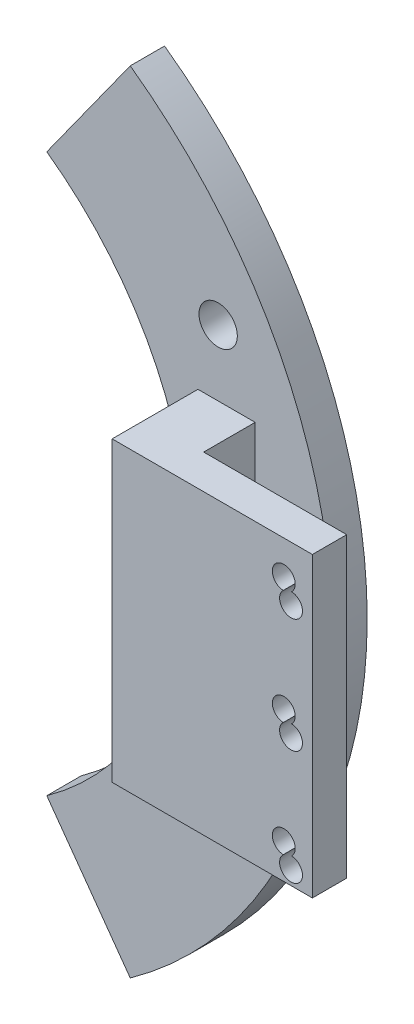
ISO-10303-21;
HEADER;
FILE_DESCRIPTION(('STEP AP214'),'2;1');
FILE_NAME('part.step','',(''),(''),'','','');
FILE_SCHEMA(('AUTOMOTIVE_DESIGN { 1 0 10303 214 1 1 1 1 }'));
ENDSEC;
DATA;
#1=APPLICATION_CONTEXT('core data for automotive mechanical design processes');
#2=APPLICATION_PROTOCOL_DEFINITION('international standard','automotive_design',2000,#1);
#3=PRODUCT_CONTEXT('',#1,'mechanical');
#4=PRODUCT('Part','Part','',(#3));
#5=PRODUCT_RELATED_PRODUCT_CATEGORY('part','',(#4));
#6=PRODUCT_DEFINITION_FORMATION('','',#4);
#7=PRODUCT_DEFINITION_CONTEXT('part definition',#1,'design');
#8=PRODUCT_DEFINITION('design','',#6,#7);
#9=PRODUCT_DEFINITION_SHAPE('','',#8);
#10=(LENGTH_UNIT() NAMED_UNIT(*) SI_UNIT(.MILLI.,.METRE.));
#11=(NAMED_UNIT(*) PLANE_ANGLE_UNIT() SI_UNIT($,.RADIAN.));
#12=(NAMED_UNIT(*) SI_UNIT($,.STERADIAN.) SOLID_ANGLE_UNIT());
#13=UNCERTAINTY_MEASURE_WITH_UNIT(LENGTH_MEASURE(1.E-05),#10,'distance_accuracy_value','');
#14=(GEOMETRIC_REPRESENTATION_CONTEXT(3) GLOBAL_UNCERTAINTY_ASSIGNED_CONTEXT((#13)) GLOBAL_UNIT_ASSIGNED_CONTEXT((#10,
#11,#12)) REPRESENTATION_CONTEXT('',''));
#15=CARTESIAN_POINT('',(0.,0.,0.));
#16=DIRECTION('',(0.,0.,1.));
#17=DIRECTION('',(1.,0.,0.));
#18=AXIS2_PLACEMENT_3D('',#15,#16,#17);
#19=CARTESIAN_POINT('',(71.4195328291549,25.9902704667621,21.));
#20=DIRECTION('',(-1.,0.,0.));
#21=DIRECTION('',(0.,0.,1.));
#22=AXIS2_PLACEMENT_3D('',#19,#20,#21);
#23=PLANE('',#22);
#24=DIRECTION('',(0.,1.,0.));
#25=VECTOR('',#24,1.);
#26=CARTESIAN_POINT('',(71.4195328291549,25.9902704667621,15.));
#27=LINE('',#26,#25);
#28=CARTESIAN_POINT('',(71.4195328291549,-26.0097295332379,15.));
#29=VERTEX_POINT('',#28);
#30=CARTESIAN_POINT('',(71.4195328291549,25.9902704667621,15.));
#31=VERTEX_POINT('',#30);
#32=EDGE_CURVE('E190',#29,#31,#27,.T.);
#33=ORIENTED_EDGE('',*,*,#32,.F.);
#34=DIRECTION('',(0.,0.,-1.));
#35=VECTOR('',#34,1.);
#36=CARTESIAN_POINT('',(71.4195328291549,-26.0097295332379,21.));
#37=LINE('',#36,#35);
#38=CARTESIAN_POINT('',(71.4195328291549,-26.0097295332379,6.));
#39=VERTEX_POINT('',#38);
#40=EDGE_CURVE('E211',#29,#39,#37,.T.);
#41=ORIENTED_EDGE('',*,*,#40,.T.);
#42=DIRECTION('',(0.,1.,0.));
#43=VECTOR('',#42,1.);
#44=CARTESIAN_POINT('',(71.4195328291549,25.9902704667621,6.));
#45=LINE('',#44,#43);
#46=CARTESIAN_POINT('',(71.4195328291549,25.9902704667621,6.));
#47=VERTEX_POINT('',#46);
#48=EDGE_CURVE('E223',#39,#47,#45,.T.);
#49=ORIENTED_EDGE('',*,*,#48,.T.);
#50=DIRECTION('',(0.,0.,-1.));
#51=VECTOR('',#50,1.);
#52=CARTESIAN_POINT('',(71.4195328291549,25.9902704667621,21.));
#53=LINE('',#52,#51);
#54=EDGE_CURVE('E204',#31,#47,#53,.T.);
#55=ORIENTED_EDGE('',*,*,#54,.F.);
#56=EDGE_LOOP('',(#33,#41,#49,#55));
#57=FACE_BOUND('',#56,.T.);
#58=ADVANCED_FACE('F41',(#57),#23,.F.);
#59=CARTESIAN_POINT('',(0.,0.,6.));
#60=DIRECTION('',(0.,0.,1.));
#61=DIRECTION('',(1.,0.,0.));
#62=AXIS2_PLACEMENT_3D('',#59,#60,#61);
#63=PLANE('',#62);
#64=DIRECTION('',(0.583333333333333,0.812232862067414,0.));
#65=VECTOR('',#64,1.);
#66=CARTESIAN_POINT('',(0.,0.,6.));
#67=LINE('',#66,#65);
#68=CARTESIAN_POINT('',(35.,48.7339717240448,6.));
#69=VERTEX_POINT('',#68);
#70=CARTESIAN_POINT('',(49.5833333333334,69.0397932757302,6.));
#71=VERTEX_POINT('',#70);
#72=EDGE_CURVE('E175',#69,#71,#67,.T.);
#73=ORIENTED_EDGE('',*,*,#72,.F.);
#74=CARTESIAN_POINT('',(0.,0.,6.));
#75=DIRECTION('',(0.,0.,1.));
#76=DIRECTION('',(1.,0.,0.));
#77=AXIS2_PLACEMENT_3D('',#74,#75,#76);
#78=CIRCLE('',#77,60.);
#79=CARTESIAN_POINT('',(35.,-48.7339717240448,6.));
#80=VERTEX_POINT('',#79);
#81=EDGE_CURVE('E237',#80,#69,#78,.T.);
#82=ORIENTED_EDGE('',*,*,#81,.F.);
#83=DIRECTION('',(-0.583333333333333,0.812232862067414,0.));
#84=VECTOR('',#83,1.);
#85=CARTESIAN_POINT('',(0.,0.,6.));
#86=LINE('',#85,#84);
#87=CARTESIAN_POINT('',(49.5833333333333,-69.0397932757302,6.));
#88=VERTEX_POINT('',#87);
#89=EDGE_CURVE('E292',#88,#80,#86,.T.);
#90=ORIENTED_EDGE('',*,*,#89,.F.);
#91=CARTESIAN_POINT('',(0.,0.,6.));
#92=DIRECTION('',(0.,0.,1.));
#93=DIRECTION('',(1.,0.,0.));
#94=AXIS2_PLACEMENT_3D('',#91,#92,#93);
#95=CIRCLE('',#94,85.);
#96=EDGE_CURVE('E245',#88,#71,#95,.T.);
#97=ORIENTED_EDGE('',*,*,#96,.T.);
#98=EDGE_LOOP('',(#73,#82,#90,#97));
#99=FACE_BOUND('',#98,.T.);
#100=CARTESIAN_POINT('',(64.9519052838327,-37.5000000000003,6.));
#101=DIRECTION('',(0.,0.,1.));
#102=DIRECTION('',(1.,0.,0.));
#103=AXIS2_PLACEMENT_3D('',#100,#101,#102);
#104=CIRCLE('',#103,3.35);
#105=CARTESIAN_POINT('',(68.3019052838327,-37.5000000000003,6.));
#106=VERTEX_POINT('',#105);
#107=EDGE_CURVE('E226',#106,#106,#104,.T.);
#108=ORIENTED_EDGE('',*,*,#107,.F.);
#109=EDGE_LOOP('',(#108));
#110=FACE_BOUND('',#109,.T.);
#111=CARTESIAN_POINT('',(64.951905283833,37.4999999999998,6.));
#112=DIRECTION('',(0.,0.,1.));
#113=DIRECTION('',(1.,0.,0.));
#114=AXIS2_PLACEMENT_3D('',#111,#112,#113);
#115=CIRCLE('',#114,3.35);
#116=CARTESIAN_POINT('',(68.301905283833,37.4999999999998,6.));
#117=VERTEX_POINT('',#116);
#118=EDGE_CURVE('E231',#117,#117,#115,.T.);
#119=ORIENTED_EDGE('',*,*,#118,.F.);
#120=EDGE_LOOP('',(#119));
#121=FACE_BOUND('',#120,.T.);
#122=DIRECTION('',(-1.,0.,0.));
#123=VECTOR('',#122,1.);
#124=CARTESIAN_POINT('',(71.4195328291549,25.9902704667621,6.));
#125=LINE('',#124,#123);
#126=CARTESIAN_POINT('',(61.4195328291549,25.9902704667621,6.));
#127=VERTEX_POINT('',#126);
#128=EDGE_CURVE('E221',#47,#127,#125,.T.);
#129=ORIENTED_EDGE('',*,*,#128,.F.);
#130=ORIENTED_EDGE('',*,*,#48,.F.);
#131=DIRECTION('',(1.,0.,0.));
#132=VECTOR('',#131,1.);
#133=CARTESIAN_POINT('',(71.4195328291549,-26.0097295332379,6.));
#134=LINE('',#133,#132);
#135=CARTESIAN_POINT('',(61.4195328291549,-26.0097295332379,6.));
#136=VERTEX_POINT('',#135);
#137=EDGE_CURVE('E214',#136,#39,#134,.T.);
#138=ORIENTED_EDGE('',*,*,#137,.F.);
#139=DIRECTION('',(0.,-1.,0.));
#140=VECTOR('',#139,1.);
#141=CARTESIAN_POINT('',(61.4195328291549,25.9902704667621,6.));
#142=LINE('',#141,#140);
#143=EDGE_CURVE('E217',#127,#136,#142,.T.);
#144=ORIENTED_EDGE('',*,*,#143,.F.);
#145=EDGE_LOOP('',(#129,#130,#138,#144));
#146=FACE_BOUND('',#145,.T.);
#147=ADVANCED_FACE('F311',(#99,#110,#121,#146),#63,.T.);
#148=CARTESIAN_POINT('',(0.,0.,0.));
#149=DIRECTION('',(0.,0.,1.));
#150=DIRECTION('',(1.,0.,0.));
#151=AXIS2_PLACEMENT_3D('',#148,#149,#150);
#152=PLANE('',#151);
#153=CARTESIAN_POINT('',(64.9519052838327,-37.5000000000003,0.));
#154=DIRECTION('',(0.,0.,1.));
#155=DIRECTION('',(1.,0.,0.));
#156=AXIS2_PLACEMENT_3D('',#153,#154,#155);
#157=CIRCLE('',#156,3.35);
#158=CARTESIAN_POINT('',(68.3019052838327,-37.5000000000003,0.));
#159=VERTEX_POINT('',#158);
#160=EDGE_CURVE('E244',#159,#159,#157,.T.);
#161=ORIENTED_EDGE('',*,*,#160,.T.);
#162=EDGE_LOOP('',(#161));
#163=FACE_BOUND('',#162,.T.);
#164=CARTESIAN_POINT('',(64.951905283833,37.4999999999998,0.));
#165=DIRECTION('',(0.,0.,1.));
#166=DIRECTION('',(1.,0.,0.));
#167=AXIS2_PLACEMENT_3D('',#164,#165,#166);
#168=CIRCLE('',#167,3.35);
#169=CARTESIAN_POINT('',(68.301905283833,37.4999999999998,0.));
#170=VERTEX_POINT('',#169);
#171=EDGE_CURVE('E234',#170,#170,#168,.T.);
#172=ORIENTED_EDGE('',*,*,#171,.T.);
#173=EDGE_LOOP('',(#172));
#174=FACE_BOUND('',#173,.T.);
#175=CARTESIAN_POINT('',(0.,0.,0.));
#176=DIRECTION('',(0.,0.,1.));
#177=DIRECTION('',(1.,0.,0.));
#178=AXIS2_PLACEMENT_3D('',#175,#176,#177);
#179=CIRCLE('',#178,60.);
#180=CARTESIAN_POINT('',(35.,-48.7339717240448,0.));
#181=VERTEX_POINT('',#180);
#182=CARTESIAN_POINT('',(35.,48.7339717240448,0.));
#183=VERTEX_POINT('',#182);
#184=EDGE_CURVE('E241',#181,#183,#179,.T.);
#185=ORIENTED_EDGE('',*,*,#184,.T.);
#186=DIRECTION('',(0.583333333333333,0.812232862067414,0.));
#187=VECTOR('',#186,1.);
#188=CARTESIAN_POINT('',(0.,0.,0.));
#189=LINE('',#188,#187);
#190=CARTESIAN_POINT('',(49.5833333333334,69.0397932757302,0.));
#191=VERTEX_POINT('',#190);
#192=EDGE_CURVE('E180',#183,#191,#189,.T.);
#193=ORIENTED_EDGE('',*,*,#192,.T.);
#194=CARTESIAN_POINT('',(0.,0.,0.));
#195=DIRECTION('',(0.,0.,1.));
#196=DIRECTION('',(1.,0.,0.));
#197=AXIS2_PLACEMENT_3D('',#194,#195,#196);
#198=CIRCLE('',#197,85.);
#199=CARTESIAN_POINT('',(49.5833333333333,-69.0397932757302,0.));
#200=VERTEX_POINT('',#199);
#201=EDGE_CURVE('E240',#200,#191,#198,.T.);
#202=ORIENTED_EDGE('',*,*,#201,.F.);
#203=DIRECTION('',(-0.583333333333333,0.812232862067414,0.));
#204=VECTOR('',#203,1.);
#205=CARTESIAN_POINT('',(0.,0.,0.));
#206=LINE('',#205,#204);
#207=EDGE_CURVE('E288',#200,#181,#206,.T.);
#208=ORIENTED_EDGE('',*,*,#207,.T.);
#209=EDGE_LOOP('',(#185,#193,#202,#208));
#210=FACE_BOUND('',#209,.T.);
#211=ADVANCED_FACE('F297',(#163,#174,#210),#152,.F.);
#212=CARTESIAN_POINT('',(0.,0.,6.));
#213=DIRECTION('',(0.,0.,-1.));
#214=DIRECTION('',(-1.,0.,0.));
#215=AXIS2_PLACEMENT_3D('',#212,#213,#214);
#216=CYLINDRICAL_SURFACE('',#215,85.);
#217=ORIENTED_EDGE('',*,*,#201,.T.);
#218=DIRECTION('',(0.,0.,1.));
#219=VECTOR('',#218,1.);
#220=CARTESIAN_POINT('',(49.5833333333334,69.0397932757302,-44.));
#221=LINE('',#220,#219);
#222=EDGE_CURVE('E285',#191,#71,#221,.T.);
#223=ORIENTED_EDGE('',*,*,#222,.T.);
#224=ORIENTED_EDGE('',*,*,#96,.F.);
#225=DIRECTION('',(0.,0.,1.));
#226=VECTOR('',#225,1.);
#227=CARTESIAN_POINT('',(49.5833333333333,-69.0397932757302,-44.));
#228=LINE('',#227,#226);
#229=EDGE_CURVE('E279',#200,#88,#228,.T.);
#230=ORIENTED_EDGE('',*,*,#229,.F.);
#231=EDGE_LOOP('',(#217,#223,#224,#230));
#232=FACE_BOUND('',#231,.T.);
#233=ADVANCED_FACE('F43',(#232),#216,.T.);
#234=CARTESIAN_POINT('',(0.,0.,6.));
#235=DIRECTION('',(0.,0.,-1.));
#236=DIRECTION('',(-1.,0.,0.));
#237=AXIS2_PLACEMENT_3D('',#234,#235,#236);
#238=CYLINDRICAL_SURFACE('',#237,60.);
#239=DIRECTION('',(0.,0.,-1.));
#240=VECTOR('',#239,1.);
#241=CARTESIAN_POINT('',(35.,48.7339717240448,6.));
#242=LINE('',#241,#240);
#243=EDGE_CURVE('E165',#183,#69,#242,.F.);
#244=ORIENTED_EDGE('',*,*,#243,.F.);
#245=ORIENTED_EDGE('',*,*,#184,.F.);
#246=DIRECTION('',(0.,0.,-1.));
#247=VECTOR('',#246,1.);
#248=CARTESIAN_POINT('',(35.,-48.7339717240448,6.));
#249=LINE('',#248,#247);
#250=EDGE_CURVE('E248',#80,#181,#249,.T.);
#251=ORIENTED_EDGE('',*,*,#250,.F.);
#252=ORIENTED_EDGE('',*,*,#81,.T.);
#253=EDGE_LOOP('',(#244,#245,#251,#252));
#254=FACE_BOUND('',#253,.T.);
#255=ADVANCED_FACE('F314',(#254),#238,.F.);
#256=CARTESIAN_POINT('',(64.951905283833,37.4999999999998,-4.));
#257=DIRECTION('',(0.,0.,1.));
#258=DIRECTION('',(1.,0.,0.));
#259=AXIS2_PLACEMENT_3D('',#256,#257,#258);
#260=CYLINDRICAL_SURFACE('',#259,3.35);
#261=ORIENTED_EDGE('',*,*,#118,.T.);
#262=EDGE_LOOP('',(#261));
#263=FACE_BOUND('',#262,.T.);
#264=ORIENTED_EDGE('',*,*,#171,.F.);
#265=EDGE_LOOP('',(#264));
#266=FACE_BOUND('',#265,.T.);
#267=ADVANCED_FACE('F352',(#263,#266),#260,.F.);
#268=CARTESIAN_POINT('',(64.9519052838327,-37.5000000000003,-4.));
#269=DIRECTION('',(0.,0.,1.));
#270=DIRECTION('',(1.,0.,0.));
#271=AXIS2_PLACEMENT_3D('',#268,#269,#270);
#272=CYLINDRICAL_SURFACE('',#271,3.35);
#273=ORIENTED_EDGE('',*,*,#107,.T.);
#274=EDGE_LOOP('',(#273));
#275=FACE_BOUND('',#274,.T.);
#276=ORIENTED_EDGE('',*,*,#160,.F.);
#277=EDGE_LOOP('',(#276));
#278=FACE_BOUND('',#277,.T.);
#279=ADVANCED_FACE('F343',(#275,#278),#272,.F.);
#280=CARTESIAN_POINT('',(71.4195328291549,25.9902704667621,21.));
#281=DIRECTION('',(0.,-1.,0.));
#282=DIRECTION('',(0.,0.,-1.));
#283=AXIS2_PLACEMENT_3D('',#280,#281,#282);
#284=PLANE('',#283);
#285=ORIENTED_EDGE('',*,*,#128,.T.);
#286=DIRECTION('',(0.,0.,-1.));
#287=VECTOR('',#286,1.);
#288=CARTESIAN_POINT('',(61.4195328291549,25.9902704667621,21.));
#289=LINE('',#288,#287);
#290=CARTESIAN_POINT('',(61.4195328291549,25.9902704667621,21.));
#291=VERTEX_POINT('',#290);
#292=EDGE_CURVE('E206',#291,#127,#289,.T.);
#293=ORIENTED_EDGE('',*,*,#292,.F.);
#294=DIRECTION('',(-1.,0.,0.));
#295=VECTOR('',#294,1.);
#296=CARTESIAN_POINT('',(71.4195328291549,25.9902704667621,21.));
#297=LINE('',#296,#295);
#298=CARTESIAN_POINT('',(96.4195328291549,25.9902704667621,21.));
#299=VERTEX_POINT('',#298);
#300=EDGE_CURVE('E218',#299,#291,#297,.T.);
#301=ORIENTED_EDGE('',*,*,#300,.F.);
#302=DIRECTION('',(0.,0.,1.));
#303=VECTOR('',#302,1.);
#304=CARTESIAN_POINT('',(96.4195328291549,25.9902704667621,21.));
#305=LINE('',#304,#303);
#306=CARTESIAN_POINT('',(96.4195328291549,25.9902704667621,15.));
#307=VERTEX_POINT('',#306);
#308=EDGE_CURVE('E194',#307,#299,#305,.T.);
#309=ORIENTED_EDGE('',*,*,#308,.F.);
#310=DIRECTION('',(-1.,0.,0.));
#311=VECTOR('',#310,1.);
#312=CARTESIAN_POINT('',(96.4195328291549,25.9902704667621,15.));
#313=LINE('',#312,#311);
#314=EDGE_CURVE('E197',#307,#31,#313,.T.);
#315=ORIENTED_EDGE('',*,*,#314,.T.);
#316=ORIENTED_EDGE('',*,*,#54,.T.);
#317=EDGE_LOOP('',(#285,#293,#301,#309,#315,#316));
#318=FACE_BOUND('',#317,.T.);
#319=ADVANCED_FACE('F340',(#318),#284,.F.);
#320=CARTESIAN_POINT('',(61.4195328291549,25.9902704667621,21.));
#321=DIRECTION('',(1.,0.,0.));
#322=DIRECTION('',(0.,1.,0.));
#323=AXIS2_PLACEMENT_3D('',#320,#321,#322);
#324=PLANE('',#323);
#325=ORIENTED_EDGE('',*,*,#143,.T.);
#326=DIRECTION('',(0.,0.,-1.));
#327=VECTOR('',#326,1.);
#328=CARTESIAN_POINT('',(61.4195328291549,-26.0097295332379,21.));
#329=LINE('',#328,#327);
#330=CARTESIAN_POINT('',(61.4195328291549,-26.0097295332379,21.));
#331=VERTEX_POINT('',#330);
#332=EDGE_CURVE('E209',#331,#136,#329,.T.);
#333=ORIENTED_EDGE('',*,*,#332,.F.);
#334=DIRECTION('',(0.,-1.,0.));
#335=VECTOR('',#334,1.);
#336=CARTESIAN_POINT('',(61.4195328291549,25.9902704667621,21.));
#337=LINE('',#336,#335);
#338=EDGE_CURVE('E228',#291,#331,#337,.T.);
#339=ORIENTED_EDGE('',*,*,#338,.F.);
#340=ORIENTED_EDGE('',*,*,#292,.T.);
#341=EDGE_LOOP('',(#325,#333,#339,#340));
#342=FACE_BOUND('',#341,.T.);
#343=ADVANCED_FACE('F342',(#342),#324,.F.);
#344=CARTESIAN_POINT('',(71.4195328291549,-26.0097295332379,21.));
#345=DIRECTION('',(0.,1.,0.));
#346=DIRECTION('',(0.,0.,1.));
#347=AXIS2_PLACEMENT_3D('',#344,#345,#346);
#348=PLANE('',#347);
#349=ORIENTED_EDGE('',*,*,#137,.T.);
#350=ORIENTED_EDGE('',*,*,#40,.F.);
#351=DIRECTION('',(-1.,0.,0.));
#352=VECTOR('',#351,1.);
#353=CARTESIAN_POINT('',(96.4195328291549,-26.0097295332379,15.));
#354=LINE('',#353,#352);
#355=CARTESIAN_POINT('',(96.4195328291549,-26.0097295332379,15.));
#356=VERTEX_POINT('',#355);
#357=EDGE_CURVE('E202',#356,#29,#354,.T.);
#358=ORIENTED_EDGE('',*,*,#357,.F.);
#359=DIRECTION('',(0.,0.,-1.));
#360=VECTOR('',#359,1.);
#361=CARTESIAN_POINT('',(96.4195328291549,-26.0097295332379,21.));
#362=LINE('',#361,#360);
#363=CARTESIAN_POINT('',(96.4195328291549,-26.0097295332379,21.));
#364=VERTEX_POINT('',#363);
#365=EDGE_CURVE('E189',#364,#356,#362,.T.);
#366=ORIENTED_EDGE('',*,*,#365,.F.);
#367=DIRECTION('',(1.,0.,0.));
#368=VECTOR('',#367,1.);
#369=CARTESIAN_POINT('',(71.4195328291549,-26.0097295332379,21.));
#370=LINE('',#369,#368);
#371=EDGE_CURVE('E213',#331,#364,#370,.T.);
#372=ORIENTED_EDGE('',*,*,#371,.F.);
#373=ORIENTED_EDGE('',*,*,#332,.T.);
#374=EDGE_LOOP('',(#349,#350,#358,#366,#372,#373));
#375=FACE_BOUND('',#374,.T.);
#376=ADVANCED_FACE('F346',(#375),#348,.F.);
#377=CARTESIAN_POINT('',(0.,0.,21.));
#378=DIRECTION('',(0.,0.,-1.));
#379=DIRECTION('',(-1.,0.,0.));
#380=AXIS2_PLACEMENT_3D('',#377,#378,#379);
#381=PLANE('',#380);
#382=CARTESIAN_POINT('',(91.4195328291549,-20.,21.));
#383=DIRECTION('',(0.,0.,1.));
#384=DIRECTION('',(1.,0.,0.));
#385=AXIS2_PLACEMENT_3D('',#382,#383,#384);
#386=CIRCLE('',#385,2.);
#387=CARTESIAN_POINT('',(92.7842781694253,-21.462008945325,21.));
#388=VERTEX_POINT('',#387);
#389=CARTESIAN_POINT('',(91.3249898370938,-21.9977641559133,21.));
#390=VERTEX_POINT('',#389);
#391=EDGE_CURVE('E171',#388,#390,#386,.T.);
#392=ORIENTED_EDGE('',*,*,#391,.F.);
#393=CARTESIAN_POINT('',(92.6897351773641,-23.4597731012383,21.));
#394=DIRECTION('',(0.,0.,-1.));
#395=DIRECTION('',(-1.,0.,0.));
#396=AXIS2_PLACEMENT_3D('',#393,#394,#395);
#397=CIRCLE('',#396,2.);
#398=EDGE_CURVE('E156',#388,#390,#397,.T.);
#399=ORIENTED_EDGE('',*,*,#398,.T.);
#400=EDGE_LOOP('',(#392,#399));
#401=FACE_BOUND('',#400,.T.);
#402=CARTESIAN_POINT('',(91.4195328291549,20.,21.));
#403=DIRECTION('',(0.,0.,1.));
#404=DIRECTION('',(-1.,0.,0.));
#405=AXIS2_PLACEMENT_3D('',#402,#403,#404);
#406=CIRCLE('',#405,2.);
#407=CARTESIAN_POINT('',(92.7842781694253,18.537991054675,21.));
#408=VERTEX_POINT('',#407);
#409=CARTESIAN_POINT('',(91.3249898370938,18.0022358440867,21.));
#410=VERTEX_POINT('',#409);
#411=EDGE_CURVE('E174',#408,#410,#406,.T.);
#412=ORIENTED_EDGE('',*,*,#411,.F.);
#413=CARTESIAN_POINT('',(92.6897351773641,16.5402268987617,21.));
#414=DIRECTION('',(0.,0.,-1.));
#415=DIRECTION('',(-1.,0.,0.));
#416=AXIS2_PLACEMENT_3D('',#413,#414,#415);
#417=CIRCLE('',#416,2.);
#418=EDGE_CURVE('E277',#408,#410,#417,.T.);
#419=ORIENTED_EDGE('',*,*,#418,.T.);
#420=EDGE_LOOP('',(#412,#419));
#421=FACE_BOUND('',#420,.T.);
#422=CARTESIAN_POINT('',(91.4195328291549,0.,21.));
#423=DIRECTION('',(0.,0.,1.));
#424=DIRECTION('',(-1.,0.,0.));
#425=AXIS2_PLACEMENT_3D('',#422,#423,#424);
#426=CIRCLE('',#425,2.);
#427=CARTESIAN_POINT('',(92.7842781694253,-1.462008945325,21.));
#428=VERTEX_POINT('',#427);
#429=CARTESIAN_POINT('',(91.3249898370938,-1.99776415591333,21.));
#430=VERTEX_POINT('',#429);
#431=EDGE_CURVE('E178',#428,#430,#426,.T.);
#432=ORIENTED_EDGE('',*,*,#431,.F.);
#433=CARTESIAN_POINT('',(92.6897351773641,-3.45977310123833,21.));
#434=DIRECTION('',(0.,0.,-1.));
#435=DIRECTION('',(-1.,0.,0.));
#436=AXIS2_PLACEMENT_3D('',#433,#434,#435);
#437=CIRCLE('',#436,2.);
#438=EDGE_CURVE('E276',#428,#430,#437,.T.);
#439=ORIENTED_EDGE('',*,*,#438,.T.);
#440=EDGE_LOOP('',(#432,#439));
#441=FACE_BOUND('',#440,.T.);
#442=ORIENTED_EDGE('',*,*,#371,.T.);
#443=DIRECTION('',(0.,-1.,0.));
#444=VECTOR('',#443,1.);
#445=CARTESIAN_POINT('',(96.4195328291549,25.9902704667621,21.));
#446=LINE('',#445,#444);
#447=EDGE_CURVE('E186',#299,#364,#446,.T.);
#448=ORIENTED_EDGE('',*,*,#447,.F.);
#449=ORIENTED_EDGE('',*,*,#300,.T.);
#450=ORIENTED_EDGE('',*,*,#338,.T.);
#451=EDGE_LOOP('',(#442,#448,#449,#450));
#452=FACE_BOUND('',#451,.T.);
#453=ADVANCED_FACE('F169',(#401,#421,#441,#452),#381,.F.);
#454=CARTESIAN_POINT('',(96.4195328291549,25.9902704667621,15.));
#455=DIRECTION('',(0.,0.,1.));
#456=DIRECTION('',(0.,-1.,0.));
#457=AXIS2_PLACEMENT_3D('',#454,#455,#456);
#458=PLANE('',#457);
#459=CARTESIAN_POINT('',(91.4195328291549,-20.,15.));
#460=DIRECTION('',(0.,0.,1.));
#461=DIRECTION('',(0.,-1.,0.));
#462=AXIS2_PLACEMENT_3D('',#459,#460,#461);
#463=CIRCLE('',#462,2.);
#464=CARTESIAN_POINT('',(92.7842781694253,-21.462008945325,15.));
#465=VERTEX_POINT('',#464);
#466=CARTESIAN_POINT('',(91.3249898370938,-21.9977641559133,15.));
#467=VERTEX_POINT('',#466);
#468=EDGE_CURVE('E199',#465,#467,#463,.T.);
#469=ORIENTED_EDGE('',*,*,#468,.T.);
#470=CARTESIAN_POINT('',(92.6897351773641,-23.4597731012383,15.));
#471=DIRECTION('',(0.,0.,1.));
#472=DIRECTION('',(0.,-1.,0.));
#473=AXIS2_PLACEMENT_3D('',#470,#471,#472);
#474=CIRCLE('',#473,2.);
#475=EDGE_CURVE('E159',#467,#465,#474,.T.);
#476=ORIENTED_EDGE('',*,*,#475,.T.);
#477=EDGE_LOOP('',(#469,#476));
#478=FACE_BOUND('',#477,.T.);
#479=CARTESIAN_POINT('',(91.4195328291549,20.,15.));
#480=DIRECTION('',(0.,0.,1.));
#481=DIRECTION('',(0.,-1.,0.));
#482=AXIS2_PLACEMENT_3D('',#479,#480,#481);
#483=CIRCLE('',#482,2.);
#484=CARTESIAN_POINT('',(92.7842781694253,18.537991054675,15.));
#485=VERTEX_POINT('',#484);
#486=CARTESIAN_POINT('',(91.3249898370938,18.0022358440867,15.));
#487=VERTEX_POINT('',#486);
#488=EDGE_CURVE('E257',#485,#487,#483,.T.);
#489=ORIENTED_EDGE('',*,*,#488,.T.);
#490=CARTESIAN_POINT('',(92.6897351773641,16.5402268987617,15.));
#491=DIRECTION('',(0.,0.,1.));
#492=DIRECTION('',(0.,-1.,0.));
#493=AXIS2_PLACEMENT_3D('',#490,#491,#492);
#494=CIRCLE('',#493,2.);
#495=EDGE_CURVE('E64',#487,#485,#494,.T.);
#496=ORIENTED_EDGE('',*,*,#495,.T.);
#497=EDGE_LOOP('',(#489,#496));
#498=FACE_BOUND('',#497,.T.);
#499=CARTESIAN_POINT('',(91.4195328291549,0.,15.));
#500=DIRECTION('',(0.,0.,1.));
#501=DIRECTION('',(0.,-1.,0.));
#502=AXIS2_PLACEMENT_3D('',#499,#500,#501);
#503=CIRCLE('',#502,2.);
#504=CARTESIAN_POINT('',(92.7842781694253,-1.462008945325,15.));
#505=VERTEX_POINT('',#504);
#506=CARTESIAN_POINT('',(91.3249898370938,-1.99776415591333,15.));
#507=VERTEX_POINT('',#506);
#508=EDGE_CURVE('E185',#505,#507,#503,.T.);
#509=ORIENTED_EDGE('',*,*,#508,.T.);
#510=CARTESIAN_POINT('',(92.6897351773641,-3.45977310123833,15.));
#511=DIRECTION('',(0.,0.,1.));
#512=DIRECTION('',(0.,-1.,0.));
#513=AXIS2_PLACEMENT_3D('',#510,#511,#512);
#514=CIRCLE('',#513,2.);
#515=EDGE_CURVE('E56',#507,#505,#514,.T.);
#516=ORIENTED_EDGE('',*,*,#515,.T.);
#517=EDGE_LOOP('',(#509,#516));
#518=FACE_BOUND('',#517,.T.);
#519=ORIENTED_EDGE('',*,*,#32,.T.);
#520=ORIENTED_EDGE('',*,*,#314,.F.);
#521=DIRECTION('',(0.,1.,0.));
#522=VECTOR('',#521,1.);
#523=CARTESIAN_POINT('',(96.4195328291549,25.9902704667621,15.));
#524=LINE('',#523,#522);
#525=EDGE_CURVE('E192',#356,#307,#524,.T.);
#526=ORIENTED_EDGE('',*,*,#525,.F.);
#527=ORIENTED_EDGE('',*,*,#357,.T.);
#528=EDGE_LOOP('',(#519,#520,#526,#527));
#529=FACE_BOUND('',#528,.T.);
#530=ADVANCED_FACE('F274',(#478,#498,#518,#529),#458,.F.);
#531=CARTESIAN_POINT('',(96.4195328291549,0.,0.));
#532=DIRECTION('',(1.,0.,0.));
#533=DIRECTION('',(0.,0.,-1.));
#534=AXIS2_PLACEMENT_3D('',#531,#532,#533);
#535=PLANE('',#534);
#536=ORIENTED_EDGE('',*,*,#447,.T.);
#537=ORIENTED_EDGE('',*,*,#365,.T.);
#538=ORIENTED_EDGE('',*,*,#525,.T.);
#539=ORIENTED_EDGE('',*,*,#308,.T.);
#540=EDGE_LOOP('',(#536,#537,#538,#539));
#541=FACE_BOUND('',#540,.T.);
#542=ADVANCED_FACE('F433',(#541),#535,.T.);
#543=CARTESIAN_POINT('',(91.4195328291549,0.,-4.));
#544=DIRECTION('',(0.,0.,1.));
#545=DIRECTION('',(1.,0.,0.));
#546=AXIS2_PLACEMENT_3D('',#543,#544,#545);
#547=CYLINDRICAL_SURFACE('',#546,2.);
#548=ORIENTED_EDGE('',*,*,#508,.F.);
#549=DIRECTION('',(0.,0.,1.));
#550=VECTOR('',#549,1.);
#551=CARTESIAN_POINT('',(92.7842781694253,-1.462008945325,16.));
#552=LINE('',#551,#550);
#553=EDGE_CURVE('E11',#505,#428,#552,.T.);
#554=ORIENTED_EDGE('',*,*,#553,.T.);
#555=ORIENTED_EDGE('',*,*,#431,.T.);
#556=DIRECTION('',(0.,0.,1.));
#557=VECTOR('',#556,1.);
#558=CARTESIAN_POINT('',(91.3249898370938,-1.99776415591333,16.));
#559=LINE('',#558,#557);
#560=EDGE_CURVE('E49',#430,#507,#559,.F.);
#561=ORIENTED_EDGE('',*,*,#560,.T.);
#562=EDGE_LOOP('',(#548,#554,#555,#561));
#563=FACE_BOUND('',#562,.T.);
#564=ADVANCED_FACE('F270',(#563),#547,.F.);
#565=CARTESIAN_POINT('',(91.4195328291549,20.,-4.));
#566=DIRECTION('',(0.,0.,1.));
#567=DIRECTION('',(1.,0.,0.));
#568=AXIS2_PLACEMENT_3D('',#565,#566,#567);
#569=CYLINDRICAL_SURFACE('',#568,2.);
#570=ORIENTED_EDGE('',*,*,#488,.F.);
#571=DIRECTION('',(0.,0.,1.));
#572=VECTOR('',#571,1.);
#573=CARTESIAN_POINT('',(92.7842781694253,18.537991054675,16.));
#574=LINE('',#573,#572);
#575=EDGE_CURVE('E266',#485,#408,#574,.T.);
#576=ORIENTED_EDGE('',*,*,#575,.T.);
#577=ORIENTED_EDGE('',*,*,#411,.T.);
#578=DIRECTION('',(0.,0.,1.));
#579=VECTOR('',#578,1.);
#580=CARTESIAN_POINT('',(91.3249898370938,18.0022358440867,16.));
#581=LINE('',#580,#579);
#582=EDGE_CURVE('E264',#410,#487,#581,.F.);
#583=ORIENTED_EDGE('',*,*,#582,.T.);
#584=EDGE_LOOP('',(#570,#576,#577,#583));
#585=FACE_BOUND('',#584,.T.);
#586=ADVANCED_FACE('F421',(#585),#569,.F.);
#587=CARTESIAN_POINT('',(91.4195328291549,-20.,-4.));
#588=DIRECTION('',(0.,0.,1.));
#589=DIRECTION('',(1.,0.,0.));
#590=AXIS2_PLACEMENT_3D('',#587,#588,#589);
#591=CYLINDRICAL_SURFACE('',#590,2.);
#592=ORIENTED_EDGE('',*,*,#468,.F.);
#593=DIRECTION('',(0.,0.,1.));
#594=VECTOR('',#593,1.);
#595=CARTESIAN_POINT('',(92.7842781694253,-21.462008945325,16.));
#596=LINE('',#595,#594);
#597=EDGE_CURVE('E164',#465,#388,#596,.T.);
#598=ORIENTED_EDGE('',*,*,#597,.T.);
#599=ORIENTED_EDGE('',*,*,#391,.T.);
#600=DIRECTION('',(0.,0.,1.));
#601=VECTOR('',#600,1.);
#602=CARTESIAN_POINT('',(91.3249898370938,-21.9977641559133,16.));
#603=LINE('',#602,#601);
#604=EDGE_CURVE('E153',#390,#467,#603,.F.);
#605=ORIENTED_EDGE('',*,*,#604,.T.);
#606=EDGE_LOOP('',(#592,#598,#599,#605));
#607=FACE_BOUND('',#606,.T.);
#608=ADVANCED_FACE('F173',(#607),#591,.F.);
#609=CARTESIAN_POINT('',(35.,-48.7339717240448,-44.));
#610=DIRECTION('',(0.812232862067414,0.583333333333333,0.));
#611=DIRECTION('',(-0.583333333333333,0.812232862067414,0.));
#612=AXIS2_PLACEMENT_3D('',#609,#610,#611);
#613=PLANE('',#612);
#614=ORIENTED_EDGE('',*,*,#89,.T.);
#615=ORIENTED_EDGE('',*,*,#250,.T.);
#616=ORIENTED_EDGE('',*,*,#207,.F.);
#617=ORIENTED_EDGE('',*,*,#229,.T.);
#618=EDGE_LOOP('',(#614,#615,#616,#617));
#619=FACE_BOUND('',#618,.T.);
#620=ADVANCED_FACE('F306',(#619),#613,.F.);
#621=CARTESIAN_POINT('',(35.,48.7339717240448,-44.));
#622=DIRECTION('',(0.812232862067414,-0.583333333333333,0.));
#623=DIRECTION('',(0.583333333333333,0.812232862067414,0.));
#624=AXIS2_PLACEMENT_3D('',#621,#622,#623);
#625=PLANE('',#624);
#626=ORIENTED_EDGE('',*,*,#72,.T.);
#627=ORIENTED_EDGE('',*,*,#222,.F.);
#628=ORIENTED_EDGE('',*,*,#192,.F.);
#629=ORIENTED_EDGE('',*,*,#243,.T.);
#630=EDGE_LOOP('',(#626,#627,#628,#629));
#631=FACE_BOUND('',#630,.T.);
#632=ADVANCED_FACE('F315',(#631),#625,.F.);
#633=CARTESIAN_POINT('',(92.6897351773641,-23.4597731012383,6.));
#634=DIRECTION('',(0.,0.,1.));
#635=DIRECTION('',(1.,0.,0.));
#636=AXIS2_PLACEMENT_3D('',#633,#634,#635);
#637=CYLINDRICAL_SURFACE('',#636,2.);
#638=ORIENTED_EDGE('',*,*,#475,.F.);
#639=ORIENTED_EDGE('',*,*,#604,.F.);
#640=ORIENTED_EDGE('',*,*,#398,.F.);
#641=ORIENTED_EDGE('',*,*,#597,.F.);
#642=EDGE_LOOP('',(#638,#639,#640,#641));
#643=FACE_BOUND('',#642,.T.);
#644=ADVANCED_FACE('F155',(#643),#637,.F.);
#645=CARTESIAN_POINT('',(92.6897351773641,16.5402268987617,6.));
#646=DIRECTION('',(0.,0.,1.));
#647=DIRECTION('',(1.,0.,0.));
#648=AXIS2_PLACEMENT_3D('',#645,#646,#647);
#649=CYLINDRICAL_SURFACE('',#648,2.);
#650=ORIENTED_EDGE('',*,*,#495,.F.);
#651=ORIENTED_EDGE('',*,*,#582,.F.);
#652=ORIENTED_EDGE('',*,*,#418,.F.);
#653=ORIENTED_EDGE('',*,*,#575,.F.);
#654=EDGE_LOOP('',(#650,#651,#652,#653));
#655=FACE_BOUND('',#654,.T.);
#656=ADVANCED_FACE('F323',(#655),#649,.F.);
#657=CARTESIAN_POINT('',(92.6897351773641,-3.45977310123833,6.));
#658=DIRECTION('',(0.,0.,1.));
#659=DIRECTION('',(1.,0.,0.));
#660=AXIS2_PLACEMENT_3D('',#657,#658,#659);
#661=CYLINDRICAL_SURFACE('',#660,2.);
#662=ORIENTED_EDGE('',*,*,#515,.F.);
#663=ORIENTED_EDGE('',*,*,#560,.F.);
#664=ORIENTED_EDGE('',*,*,#438,.F.);
#665=ORIENTED_EDGE('',*,*,#553,.F.);
#666=EDGE_LOOP('',(#662,#663,#664,#665));
#667=FACE_BOUND('',#666,.T.);
#668=ADVANCED_FACE('F409',(#667),#661,.F.);
#669=CLOSED_SHELL('',(#58,#147,#211,#233,#255,#267,#279,#319,#343,#376,#453,#530,#542,#564,#586,
#608,#620,#632,#644,#656,#668));
#670=MANIFOLD_SOLID_BREP('B2',#669);
#671=ADVANCED_BREP_SHAPE_REPRESENTATION('',(#18,#670),#14);
#672=SHAPE_DEFINITION_REPRESENTATION(#9,#671);
ENDSEC;
END-ISO-10303-21;
